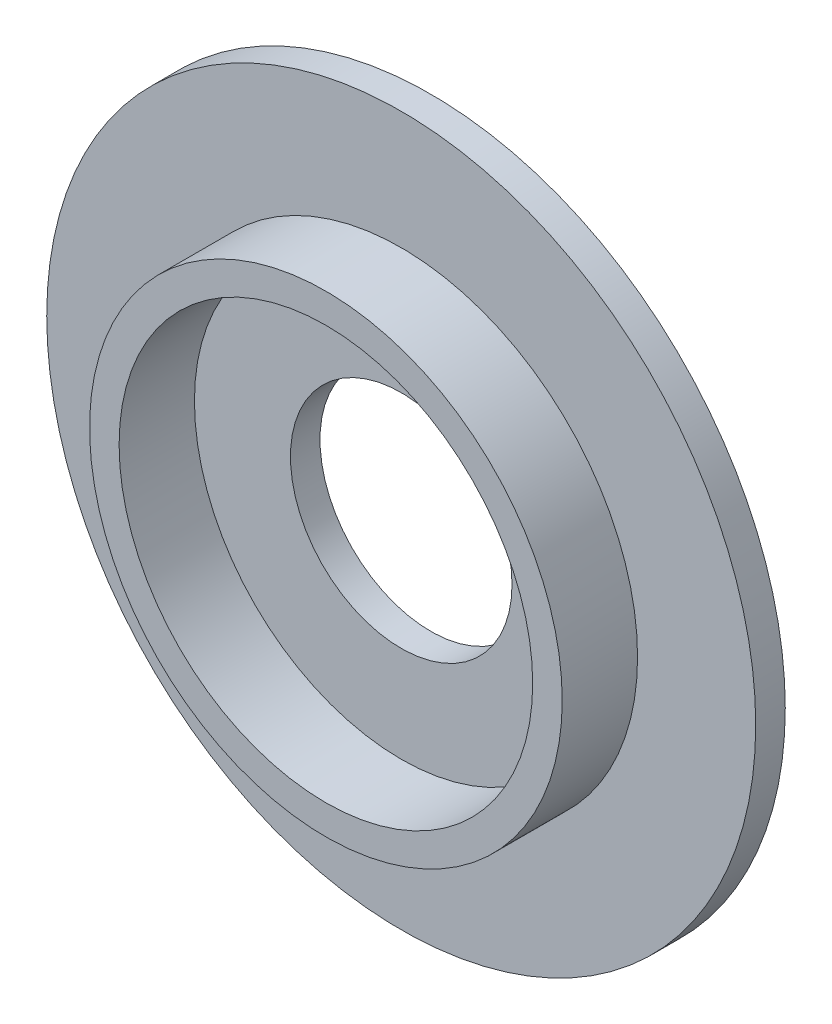
ISO-10303-21;
HEADER;
FILE_DESCRIPTION(('STEP AP214'),'2;1');
FILE_NAME('part.step','',(''),(''),'','','');
FILE_SCHEMA(('AUTOMOTIVE_DESIGN { 1 0 10303 214 1 1 1 1 }'));
ENDSEC;
DATA;
#1=APPLICATION_CONTEXT('core data for automotive mechanical design processes');
#2=APPLICATION_PROTOCOL_DEFINITION('international standard','automotive_design',2000,#1);
#3=PRODUCT_CONTEXT('',#1,'mechanical');
#4=PRODUCT('Part','Part','',(#3));
#5=PRODUCT_RELATED_PRODUCT_CATEGORY('part','',(#4));
#6=PRODUCT_DEFINITION_FORMATION('','',#4);
#7=PRODUCT_DEFINITION_CONTEXT('part definition',#1,'design');
#8=PRODUCT_DEFINITION('design','',#6,#7);
#9=PRODUCT_DEFINITION_SHAPE('','',#8);
#10=(LENGTH_UNIT() NAMED_UNIT(*) SI_UNIT(.MILLI.,.METRE.));
#11=(NAMED_UNIT(*) PLANE_ANGLE_UNIT() SI_UNIT($,.RADIAN.));
#12=(NAMED_UNIT(*) SI_UNIT($,.STERADIAN.) SOLID_ANGLE_UNIT());
#13=UNCERTAINTY_MEASURE_WITH_UNIT(LENGTH_MEASURE(1.E-05),#10,'distance_accuracy_value','');
#14=(GEOMETRIC_REPRESENTATION_CONTEXT(3) GLOBAL_UNCERTAINTY_ASSIGNED_CONTEXT((#13)) GLOBAL_UNIT_ASSIGNED_CONTEXT((#10,
#11,#12)) REPRESENTATION_CONTEXT('',''));
#15=CARTESIAN_POINT('',(0.,0.,0.));
#16=DIRECTION('',(0.,0.,1.));
#17=DIRECTION('',(1.,0.,0.));
#18=AXIS2_PLACEMENT_3D('',#15,#16,#17);
#19=CARTESIAN_POINT('',(0.,0.,10.));
#20=DIRECTION('',(0.,0.,1.));
#21=DIRECTION('',(1.,0.,0.));
#22=AXIS2_PLACEMENT_3D('',#19,#20,#21);
#23=PLANE('',#22);
#24=CARTESIAN_POINT('',(0.,0.,10.));
#25=DIRECTION('',(0.,0.,1.));
#26=DIRECTION('',(1.,0.,0.));
#27=AXIS2_PLACEMENT_3D('',#24,#25,#26);
#28=CIRCLE('',#27,120.);
#29=CARTESIAN_POINT('',(120.,0.,10.));
#30=VERTEX_POINT('',#29);
#31=EDGE_CURVE('E49',#30,#30,#28,.T.);
#32=ORIENTED_EDGE('',*,*,#31,.T.);
#33=EDGE_LOOP('',(#32));
#34=FACE_BOUND('',#33,.T.);
#35=CARTESIAN_POINT('',(0.,0.,10.));
#36=DIRECTION('',(0.,0.,1.));
#37=DIRECTION('',(1.,0.,0.));
#38=AXIS2_PLACEMENT_3D('',#35,#36,#37);
#39=CIRCLE('',#38,80.);
#40=CARTESIAN_POINT('',(80.,0.,10.));
#41=VERTEX_POINT('',#40);
#42=EDGE_CURVE('E70',#41,#41,#39,.T.);
#43=ORIENTED_EDGE('',*,*,#42,.F.);
#44=EDGE_LOOP('',(#43));
#45=FACE_BOUND('',#44,.T.);
#46=ADVANCED_FACE('F41',(#34,#45),#23,.T.);
#47=CARTESIAN_POINT('',(0.,0.,10.));
#48=DIRECTION('',(0.,0.,1.));
#49=DIRECTION('',(1.,0.,0.));
#50=AXIS2_PLACEMENT_3D('',#47,#48,#49);
#51=CIRCLE('',#50,70.);
#52=CARTESIAN_POINT('',(70.,0.,10.));
#53=VERTEX_POINT('',#52);
#54=EDGE_CURVE('E10',#53,#53,#51,.F.);
#55=ORIENTED_EDGE('',*,*,#54,.F.);
#56=EDGE_LOOP('',(#55));
#57=FACE_BOUND('',#56,.T.);
#58=CARTESIAN_POINT('',(0.,0.,10.));
#59=DIRECTION('',(0.,0.,1.));
#60=DIRECTION('',(1.,0.,0.));
#61=AXIS2_PLACEMENT_3D('',#58,#59,#60);
#62=CIRCLE('',#61,37.5);
#63=CARTESIAN_POINT('',(37.5,0.,10.));
#64=VERTEX_POINT('',#63);
#65=EDGE_CURVE('E60',#64,#64,#62,.T.);
#66=ORIENTED_EDGE('',*,*,#65,.F.);
#67=EDGE_LOOP('',(#66));
#68=FACE_BOUND('',#67,.T.);
#69=ADVANCED_FACE('F100',(#57,#68),#23,.T.);
#70=CARTESIAN_POINT('',(0.,0.,0.));
#71=DIRECTION('',(0.,0.,1.));
#72=DIRECTION('',(1.,0.,0.));
#73=AXIS2_PLACEMENT_3D('',#70,#71,#72);
#74=PLANE('',#73);
#75=CARTESIAN_POINT('',(0.,0.,0.));
#76=DIRECTION('',(0.,0.,1.));
#77=DIRECTION('',(1.,0.,0.));
#78=AXIS2_PLACEMENT_3D('',#75,#76,#77);
#79=CIRCLE('',#78,120.);
#80=CARTESIAN_POINT('',(120.,0.,0.));
#81=VERTEX_POINT('',#80);
#82=EDGE_CURVE('E54',#81,#81,#79,.T.);
#83=ORIENTED_EDGE('',*,*,#82,.F.);
#84=EDGE_LOOP('',(#83));
#85=FACE_BOUND('',#84,.T.);
#86=CARTESIAN_POINT('',(0.,0.,0.));
#87=DIRECTION('',(0.,0.,1.));
#88=DIRECTION('',(1.,0.,0.));
#89=AXIS2_PLACEMENT_3D('',#86,#87,#88);
#90=CIRCLE('',#89,37.5);
#91=CARTESIAN_POINT('',(37.5,0.,0.));
#92=VERTEX_POINT('',#91);
#93=EDGE_CURVE('E62',#92,#92,#90,.T.);
#94=ORIENTED_EDGE('',*,*,#93,.T.);
#95=EDGE_LOOP('',(#94));
#96=FACE_BOUND('',#95,.T.);
#97=ADVANCED_FACE('F105',(#85,#96),#74,.F.);
#98=CARTESIAN_POINT('',(0.,0.,10.));
#99=DIRECTION('',(0.,0.,-1.));
#100=DIRECTION('',(-1.,0.,0.));
#101=AXIS2_PLACEMENT_3D('',#98,#99,#100);
#102=CYLINDRICAL_SURFACE('',#101,120.);
#103=ORIENTED_EDGE('',*,*,#31,.F.);
#104=EDGE_LOOP('',(#103));
#105=FACE_BOUND('',#104,.T.);
#106=ORIENTED_EDGE('',*,*,#82,.T.);
#107=EDGE_LOOP('',(#106));
#108=FACE_BOUND('',#107,.T.);
#109=ADVANCED_FACE('F43',(#105,#108),#102,.T.);
#110=CARTESIAN_POINT('',(0.,0.,10.));
#111=DIRECTION('',(0.,0.,-1.));
#112=DIRECTION('',(-1.,0.,0.));
#113=AXIS2_PLACEMENT_3D('',#110,#111,#112);
#114=CYLINDRICAL_SURFACE('',#113,37.5);
#115=ORIENTED_EDGE('',*,*,#65,.T.);
#116=EDGE_LOOP('',(#115));
#117=FACE_BOUND('',#116,.T.);
#118=ORIENTED_EDGE('',*,*,#93,.F.);
#119=EDGE_LOOP('',(#118));
#120=FACE_BOUND('',#119,.T.);
#121=ADVANCED_FACE('F87',(#117,#120),#114,.F.);
#122=CARTESIAN_POINT('',(0.,0.,35.5));
#123=DIRECTION('',(0.,0.,1.));
#124=DIRECTION('',(1.,0.,0.));
#125=AXIS2_PLACEMENT_3D('',#122,#123,#124);
#126=PLANE('',#125);
#127=CARTESIAN_POINT('',(0.,0.,35.5));
#128=DIRECTION('',(0.,0.,1.));
#129=DIRECTION('',(1.,0.,0.));
#130=AXIS2_PLACEMENT_3D('',#127,#128,#129);
#131=CIRCLE('',#130,80.);
#132=CARTESIAN_POINT('',(80.,0.,35.5));
#133=VERTEX_POINT('',#132);
#134=EDGE_CURVE('E66',#133,#133,#131,.T.);
#135=ORIENTED_EDGE('',*,*,#134,.T.);
#136=EDGE_LOOP('',(#135));
#137=FACE_BOUND('',#136,.T.);
#138=CARTESIAN_POINT('',(0.,0.,35.5));
#139=DIRECTION('',(0.,0.,1.));
#140=DIRECTION('',(1.,0.,0.));
#141=AXIS2_PLACEMENT_3D('',#138,#139,#140);
#142=CIRCLE('',#141,70.);
#143=CARTESIAN_POINT('',(70.,0.,35.5));
#144=VERTEX_POINT('',#143);
#145=EDGE_CURVE('E74',#144,#144,#142,.T.);
#146=ORIENTED_EDGE('',*,*,#145,.F.);
#147=EDGE_LOOP('',(#146));
#148=FACE_BOUND('',#147,.T.);
#149=ADVANCED_FACE('F84',(#137,#148),#126,.T.);
#150=CARTESIAN_POINT('',(0.,0.,35.5));
#151=DIRECTION('',(0.,0.,-1.));
#152=DIRECTION('',(-1.,0.,0.));
#153=AXIS2_PLACEMENT_3D('',#150,#151,#152);
#154=CYLINDRICAL_SURFACE('',#153,80.);
#155=ORIENTED_EDGE('',*,*,#134,.F.);
#156=EDGE_LOOP('',(#155));
#157=FACE_BOUND('',#156,.T.);
#158=ORIENTED_EDGE('',*,*,#42,.T.);
#159=EDGE_LOOP('',(#158));
#160=FACE_BOUND('',#159,.T.);
#161=ADVANCED_FACE('F86',(#157,#160),#154,.T.);
#162=CARTESIAN_POINT('',(0.,0.,35.5));
#163=DIRECTION('',(0.,0.,-1.));
#164=DIRECTION('',(-1.,0.,0.));
#165=AXIS2_PLACEMENT_3D('',#162,#163,#164);
#166=CYLINDRICAL_SURFACE('',#165,70.);
#167=ORIENTED_EDGE('',*,*,#145,.T.);
#168=EDGE_LOOP('',(#167));
#169=FACE_BOUND('',#168,.T.);
#170=ORIENTED_EDGE('',*,*,#54,.T.);
#171=EDGE_LOOP('',(#170));
#172=FACE_BOUND('',#171,.T.);
#173=ADVANCED_FACE('F82',(#169,#172),#166,.F.);
#174=CLOSED_SHELL('',(#46,#69,#97,#109,#121,#149,#161,#173));
#175=MANIFOLD_SOLID_BREP('B2',#174);
#176=ADVANCED_BREP_SHAPE_REPRESENTATION('',(#18,#175),#14);
#177=SHAPE_DEFINITION_REPRESENTATION(#9,#176);
ENDSEC;
END-ISO-10303-21;
